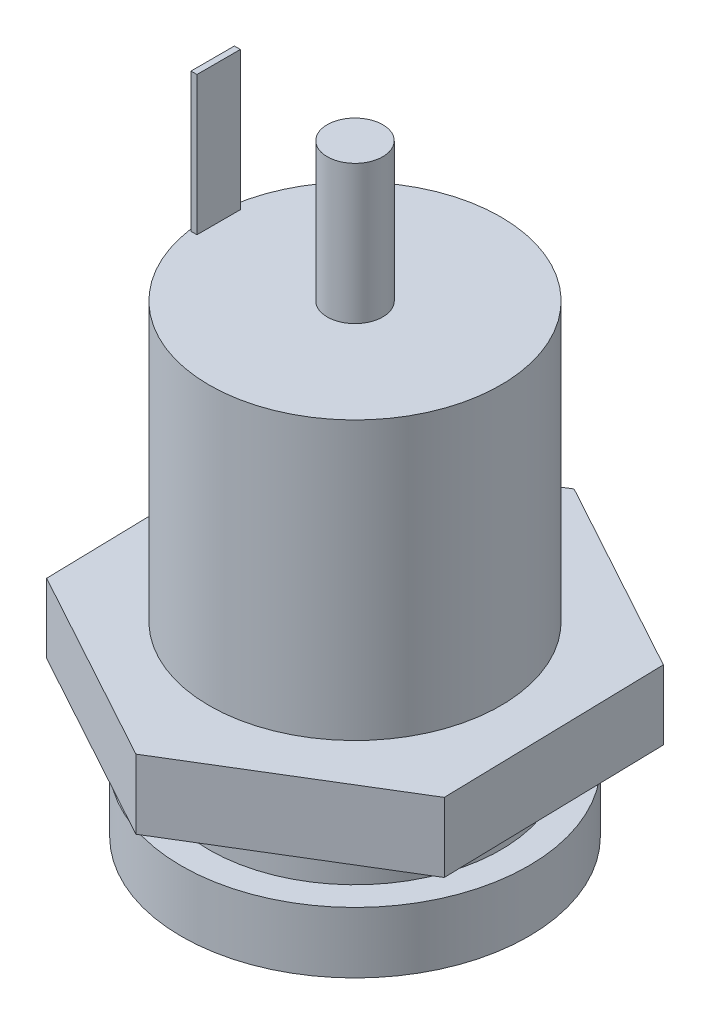
ISO-10303-21;
HEADER;
FILE_DESCRIPTION(('STEP AP214'),'2;1');
FILE_NAME('part.step','',(''),(''),'','','');
FILE_SCHEMA(('AUTOMOTIVE_DESIGN { 1 0 10303 214 1 1 1 1 }'));
ENDSEC;
DATA;
#1=APPLICATION_CONTEXT('core data for automotive mechanical design processes');
#2=APPLICATION_PROTOCOL_DEFINITION('international standard','automotive_design',2000,#1);
#3=PRODUCT_CONTEXT('',#1,'mechanical');
#4=PRODUCT('Part','Part','',(#3));
#5=PRODUCT_RELATED_PRODUCT_CATEGORY('part','',(#4));
#6=PRODUCT_DEFINITION_FORMATION('','',#4);
#7=PRODUCT_DEFINITION_CONTEXT('part definition',#1,'design');
#8=PRODUCT_DEFINITION('design','',#6,#7);
#9=PRODUCT_DEFINITION_SHAPE('','',#8);
#10=(LENGTH_UNIT() NAMED_UNIT(*) SI_UNIT(.MILLI.,.METRE.));
#11=(NAMED_UNIT(*) PLANE_ANGLE_UNIT() SI_UNIT($,.RADIAN.));
#12=(NAMED_UNIT(*) SI_UNIT($,.STERADIAN.) SOLID_ANGLE_UNIT());
#13=UNCERTAINTY_MEASURE_WITH_UNIT(LENGTH_MEASURE(1.E-05),#10,'distance_accuracy_value','');
#14=(GEOMETRIC_REPRESENTATION_CONTEXT(3) GLOBAL_UNCERTAINTY_ASSIGNED_CONTEXT((#13)) GLOBAL_UNIT_ASSIGNED_CONTEXT((#10,
#11,#12)) REPRESENTATION_CONTEXT('',''));
#15=CARTESIAN_POINT('',(0.,0.,0.));
#16=DIRECTION('',(0.,0.,1.));
#17=DIRECTION('',(1.,0.,0.));
#18=AXIS2_PLACEMENT_3D('',#15,#16,#17);
#19=CARTESIAN_POINT('',(0.,14.5,0.));
#20=DIRECTION('',(0.,1.,0.));
#21=DIRECTION('',(0.,0.,1.));
#22=AXIS2_PLACEMENT_3D('',#19,#20,#21);
#23=PLANE('',#22);
#24=CARTESIAN_POINT('',(0.,14.5,0.));
#25=DIRECTION('',(0.,1.,0.));
#26=DIRECTION('',(0.,0.,1.));
#27=AXIS2_PLACEMENT_3D('',#24,#25,#26);
#28=CIRCLE('',#27,1.);
#29=CARTESIAN_POINT('',(0.,14.5,1.));
#30=VERTEX_POINT('',#29);
#31=EDGE_CURVE('E55',#30,#30,#28,.T.);
#32=ORIENTED_EDGE('',*,*,#31,.F.);
#33=EDGE_LOOP('',(#32));
#34=FACE_BOUND('',#33,.T.);
#35=CARTESIAN_POINT('',(0.,14.5,0.));
#36=DIRECTION('',(0.,1.,0.));
#37=DIRECTION('',(0.,0.,1.));
#38=AXIS2_PLACEMENT_3D('',#35,#36,#37);
#39=CIRCLE('',#38,5.25);
#40=CARTESIAN_POINT('',(0.,14.5,-5.25));
#41=VERTEX_POINT('',#40);
#42=EDGE_CURVE('E181',#41,#41,#39,.T.);
#43=ORIENTED_EDGE('',*,*,#42,.T.);
#44=EDGE_LOOP('',(#43));
#45=FACE_BOUND('',#44,.T.);
#46=DIRECTION('',(1.,0.,0.));
#47=VECTOR('',#46,1.);
#48=CARTESIAN_POINT('',(-4.91146165372565,14.5,0.781146982699853));
#49=LINE('',#48,#47);
#50=CARTESIAN_POINT('',(-5.12627707396812,14.5,0.781146982699853));
#51=VERTEX_POINT('',#50);
#52=CARTESIAN_POINT('',(-4.91146165372565,14.5,0.781146982699853));
#53=VERTEX_POINT('',#52);
#54=EDGE_CURVE('E204',#51,#53,#49,.T.);
#55=ORIENTED_EDGE('',*,*,#54,.F.);
#56=DIRECTION('',(0.,0.,1.));
#57=VECTOR('',#56,1.);
#58=CARTESIAN_POINT('',(-5.12627707396812,14.5,-0.781146982699853));
#59=LINE('',#58,#57);
#60=CARTESIAN_POINT('',(-5.12627707396812,14.5,-0.781146982699853));
#61=VERTEX_POINT('',#60);
#62=EDGE_CURVE('E182',#61,#51,#59,.T.);
#63=ORIENTED_EDGE('',*,*,#62,.F.);
#64=DIRECTION('',(-1.,0.,0.));
#65=VECTOR('',#64,1.);
#66=CARTESIAN_POINT('',(-4.91146165372565,14.5,-0.781146982699853));
#67=LINE('',#66,#65);
#68=CARTESIAN_POINT('',(-4.91146165372565,14.5,-0.781146982699853));
#69=VERTEX_POINT('',#68);
#70=EDGE_CURVE('E92',#69,#61,#67,.T.);
#71=ORIENTED_EDGE('',*,*,#70,.F.);
#72=DIRECTION('',(0.,0.,-1.));
#73=VECTOR('',#72,1.);
#74=CARTESIAN_POINT('',(-4.91146165372565,14.5,-0.781146982699853));
#75=LINE('',#74,#73);
#76=EDGE_CURVE('E200',#53,#69,#75,.T.);
#77=ORIENTED_EDGE('',*,*,#76,.F.);
#78=EDGE_LOOP('',(#55,#63,#71,#77));
#79=FACE_BOUND('',#78,.T.);
#80=ADVANCED_FACE('F45',(#34,#45,#79),#23,.T.);
#81=CARTESIAN_POINT('',(0.,14.5,0.));
#82=DIRECTION('',(0.,-1.,0.));
#83=DIRECTION('',(0.,0.,-1.));
#84=AXIS2_PLACEMENT_3D('',#81,#82,#83);
#85=CYLINDRICAL_SURFACE('',#84,5.25);
#86=CARTESIAN_POINT('',(0.,4.5,0.));
#87=DIRECTION('',(0.,1.,0.));
#88=DIRECTION('',(0.,0.,1.));
#89=AXIS2_PLACEMENT_3D('',#86,#87,#88);
#90=CIRCLE('',#89,5.25);
#91=CARTESIAN_POINT('',(0.,4.5,-5.25));
#92=VERTEX_POINT('',#91);
#93=EDGE_CURVE('E49',#92,#92,#90,.T.);
#94=CARTESIAN_POINT('',(0.,4.5,-5.25));
#95=CARTESIAN_POINT('',(0.,4.60416666666667,-5.25));
#96=CARTESIAN_POINT('',(0.,4.70833333333333,-5.25));
#97=CARTESIAN_POINT('',(0.,4.91666666666667,-5.25));
#98=CARTESIAN_POINT('',(0.,5.02083333333333,-5.25));
#99=CARTESIAN_POINT('',(0.,5.22916666666667,-5.25));
#100=CARTESIAN_POINT('',(0.,5.33333333333333,-5.25));
#101=CARTESIAN_POINT('',(0.,5.54166666666667,-5.25));
#102=CARTESIAN_POINT('',(0.,5.64583333333333,-5.25));
#103=CARTESIAN_POINT('',(0.,5.85416666666667,-5.25));
#104=CARTESIAN_POINT('',(0.,5.95833333333333,-5.25));
#105=CARTESIAN_POINT('',(0.,6.16666666666667,-5.25));
#106=CARTESIAN_POINT('',(0.,6.27083333333333,-5.25));
#107=CARTESIAN_POINT('',(0.,6.47916666666667,-5.25));
#108=CARTESIAN_POINT('',(0.,6.58333333333333,-5.25));
#109=CARTESIAN_POINT('',(0.,6.79166666666667,-5.25));
#110=CARTESIAN_POINT('',(0.,6.89583333333333,-5.25));
#111=CARTESIAN_POINT('',(0.,7.10416666666667,-5.25));
#112=CARTESIAN_POINT('',(0.,7.20833333333333,-5.25));
#113=CARTESIAN_POINT('',(0.,7.41666666666667,-5.25));
#114=CARTESIAN_POINT('',(0.,7.52083333333333,-5.25));
#115=CARTESIAN_POINT('',(0.,7.72916666666667,-5.25));
#116=CARTESIAN_POINT('',(0.,7.83333333333333,-5.25));
#117=CARTESIAN_POINT('',(0.,8.04166666666667,-5.25));
#118=CARTESIAN_POINT('',(0.,8.14583333333333,-5.25));
#119=CARTESIAN_POINT('',(0.,8.35416666666667,-5.25));
#120=CARTESIAN_POINT('',(0.,8.45833333333333,-5.25));
#121=CARTESIAN_POINT('',(0.,8.66666666666667,-5.25));
#122=CARTESIAN_POINT('',(0.,8.77083333333333,-5.25));
#123=CARTESIAN_POINT('',(0.,8.97916666666667,-5.25));
#124=CARTESIAN_POINT('',(0.,9.08333333333333,-5.25));
#125=CARTESIAN_POINT('',(0.,9.29166666666667,-5.25));
#126=CARTESIAN_POINT('',(0.,9.39583333333333,-5.25));
#127=CARTESIAN_POINT('',(0.,9.60416666666667,-5.25));
#128=CARTESIAN_POINT('',(0.,9.70833333333333,-5.25));
#129=CARTESIAN_POINT('',(0.,9.91666666666667,-5.25));
#130=CARTESIAN_POINT('',(0.,10.0208333333333,-5.25));
#131=CARTESIAN_POINT('',(0.,10.2291666666667,-5.25));
#132=CARTESIAN_POINT('',(0.,10.3333333333333,-5.25));
#133=CARTESIAN_POINT('',(0.,10.5416666666667,-5.25));
#134=CARTESIAN_POINT('',(0.,10.6458333333333,-5.25));
#135=CARTESIAN_POINT('',(0.,10.8541666666667,-5.25));
#136=CARTESIAN_POINT('',(0.,10.9583333333333,-5.25));
#137=CARTESIAN_POINT('',(0.,11.1666666666667,-5.25));
#138=CARTESIAN_POINT('',(0.,11.2708333333333,-5.25));
#139=CARTESIAN_POINT('',(0.,11.4791666666667,-5.25));
#140=CARTESIAN_POINT('',(0.,11.5833333333333,-5.25));
#141=CARTESIAN_POINT('',(0.,11.7916666666667,-5.25));
#142=CARTESIAN_POINT('',(0.,11.8958333333333,-5.25));
#143=CARTESIAN_POINT('',(0.,12.1041666666667,-5.25));
#144=CARTESIAN_POINT('',(0.,12.2083333333333,-5.25));
#145=CARTESIAN_POINT('',(0.,12.4166666666667,-5.25));
#146=CARTESIAN_POINT('',(0.,12.5208333333333,-5.25));
#147=CARTESIAN_POINT('',(0.,12.7291666666667,-5.25));
#148=CARTESIAN_POINT('',(0.,12.8333333333333,-5.25));
#149=CARTESIAN_POINT('',(0.,13.0416666666667,-5.25));
#150=CARTESIAN_POINT('',(0.,13.1458333333333,-5.25));
#151=CARTESIAN_POINT('',(0.,13.3541666666667,-5.25));
#152=CARTESIAN_POINT('',(0.,13.4583333333333,-5.25));
#153=CARTESIAN_POINT('',(0.,13.6666666666667,-5.25));
#154=CARTESIAN_POINT('',(0.,13.7708333333333,-5.25));
#155=CARTESIAN_POINT('',(0.,13.9791666666667,-5.25));
#156=CARTESIAN_POINT('',(0.,14.0833333333333,-5.25));
#157=CARTESIAN_POINT('',(0.,14.2916666666667,-5.25));
#158=CARTESIAN_POINT('',(0.,14.3958333333333,-5.25));
#159=CARTESIAN_POINT('',(0.,14.5,-5.25));
#160=B_SPLINE_CURVE_WITH_KNOTS('',3,(#94,#95,#96,#97,#98,#99,#100,#101,#102,#103,#104,#105,#106,
#107,#108,#109,#110,#111,#112,#113,#114,#115,#116,#117,#118,#119,#120,#121,#122,#123,#124,#125,
#126,#127,#128,#129,#130,#131,#132,#133,#134,#135,#136,#137,#138,#139,#140,#141,#142,#143,#144,
#145,#146,#147,#148,#149,#150,#151,#152,#153,#154,#155,#156,#157,#158,#159),.UNSPECIFIED.,.F.,
.F.,(4,2,2,2,2,2,2,2,2,2,2,2,2,2,2,2,2,2,2,2,2,2,2,2,2,2,2,2,2,2,2,2,4),(0.,0.3125,
0.625000000000001,0.937500000000001,1.25,1.5625,1.875,2.1875,2.5,2.8125,3.125,3.4375,3.75,
4.0625,4.375,4.6875,5.,5.3125,5.625,5.9375,6.25,6.5625,6.875,7.1875,7.5,7.8125,8.125,8.4375,
8.75,9.0625,9.375,9.6875,10.),.UNSPECIFIED.);
#161=EDGE_CURVE('BSEAM47',#92,#41,#160,.T.);
#162=ORIENTED_EDGE('',*,*,#93,.T.);
#163=ORIENTED_EDGE('',*,*,#42,.F.);
#164=ORIENTED_EDGE('',*,*,#161,.T.);
#165=ORIENTED_EDGE('',*,*,#161,.F.);
#166=EDGE_LOOP('',(#162,#164,#163,#165));
#167=FACE_BOUND('',#166,.T.);
#168=ADVANCED_FACE('F47',(#167),#85,.T.);
#169=CARTESIAN_POINT('',(-5.12627707396812,19.5,-0.781146982699853));
#170=DIRECTION('',(1.,0.,0.));
#171=DIRECTION('',(0.,0.,-1.));
#172=AXIS2_PLACEMENT_3D('',#169,#170,#171);
#173=PLANE('',#172);
#174=ORIENTED_EDGE('',*,*,#62,.T.);
#175=DIRECTION('',(0.,-1.,0.));
#176=VECTOR('',#175,1.);
#177=CARTESIAN_POINT('',(-5.12627707396812,19.5,0.781146982699853));
#178=LINE('',#177,#176);
#179=CARTESIAN_POINT('',(-5.12627707396812,19.5,0.781146982699853));
#180=VERTEX_POINT('',#179);
#181=EDGE_CURVE('E71',#180,#51,#178,.T.);
#182=ORIENTED_EDGE('',*,*,#181,.F.);
#183=DIRECTION('',(0.,0.,1.));
#184=VECTOR('',#183,1.);
#185=CARTESIAN_POINT('',(-5.12627707396812,19.5,-0.781146982699853));
#186=LINE('',#185,#184);
#187=CARTESIAN_POINT('',(-5.12627707396812,19.5,-0.781146982699853));
#188=VERTEX_POINT('',#187);
#189=EDGE_CURVE('E201',#188,#180,#186,.T.);
#190=ORIENTED_EDGE('',*,*,#189,.F.);
#191=DIRECTION('',(0.,-1.,0.));
#192=VECTOR('',#191,1.);
#193=CARTESIAN_POINT('',(-5.12627707396812,19.5,-0.781146982699853));
#194=LINE('',#193,#192);
#195=EDGE_CURVE('E194',#188,#61,#194,.T.);
#196=ORIENTED_EDGE('',*,*,#195,.T.);
#197=EDGE_LOOP('',(#174,#182,#190,#196));
#198=FACE_BOUND('',#197,.T.);
#199=ADVANCED_FACE('F254',(#198),#173,.F.);
#200=CARTESIAN_POINT('',(-4.91146165372565,19.5,0.781146982699853));
#201=DIRECTION('',(0.,0.,-1.));
#202=DIRECTION('',(-1.,0.,0.));
#203=AXIS2_PLACEMENT_3D('',#200,#201,#202);
#204=PLANE('',#203);
#205=ORIENTED_EDGE('',*,*,#54,.T.);
#206=DIRECTION('',(0.,-1.,0.));
#207=VECTOR('',#206,1.);
#208=CARTESIAN_POINT('',(-4.91146165372565,19.5,0.781146982699853));
#209=LINE('',#208,#207);
#210=CARTESIAN_POINT('',(-4.91146165372565,19.5,0.781146982699853));
#211=VERTEX_POINT('',#210);
#212=EDGE_CURVE('E188',#211,#53,#209,.T.);
#213=ORIENTED_EDGE('',*,*,#212,.F.);
#214=DIRECTION('',(1.,0.,0.));
#215=VECTOR('',#214,1.);
#216=CARTESIAN_POINT('',(-4.91146165372565,19.5,0.781146982699853));
#217=LINE('',#216,#215);
#218=EDGE_CURVE('E88',#180,#211,#217,.T.);
#219=ORIENTED_EDGE('',*,*,#218,.F.);
#220=ORIENTED_EDGE('',*,*,#181,.T.);
#221=EDGE_LOOP('',(#205,#213,#219,#220));
#222=FACE_BOUND('',#221,.T.);
#223=ADVANCED_FACE('F270',(#222),#204,.F.);
#224=CARTESIAN_POINT('',(-4.91146165372565,19.5,-0.781146982699853));
#225=DIRECTION('',(-1.,0.,0.));
#226=DIRECTION('',(0.,0.,1.));
#227=AXIS2_PLACEMENT_3D('',#224,#225,#226);
#228=PLANE('',#227);
#229=ORIENTED_EDGE('',*,*,#76,.T.);
#230=DIRECTION('',(0.,-1.,0.));
#231=VECTOR('',#230,1.);
#232=CARTESIAN_POINT('',(-4.91146165372565,19.5,-0.781146982699853));
#233=LINE('',#232,#231);
#234=CARTESIAN_POINT('',(-4.91146165372565,19.5,-0.781146982699853));
#235=VERTEX_POINT('',#234);
#236=EDGE_CURVE('E62',#235,#69,#233,.T.);
#237=ORIENTED_EDGE('',*,*,#236,.F.);
#238=DIRECTION('',(0.,0.,-1.));
#239=VECTOR('',#238,1.);
#240=CARTESIAN_POINT('',(-4.91146165372565,19.5,-0.781146982699853));
#241=LINE('',#240,#239);
#242=EDGE_CURVE('E211',#211,#235,#241,.T.);
#243=ORIENTED_EDGE('',*,*,#242,.F.);
#244=ORIENTED_EDGE('',*,*,#212,.T.);
#245=EDGE_LOOP('',(#229,#237,#243,#244));
#246=FACE_BOUND('',#245,.T.);
#247=ADVANCED_FACE('F267',(#246),#228,.F.);
#248=CARTESIAN_POINT('',(-4.91146165372565,19.5,-0.781146982699853));
#249=DIRECTION('',(0.,0.,1.));
#250=DIRECTION('',(1.,0.,0.));
#251=AXIS2_PLACEMENT_3D('',#248,#249,#250);
#252=PLANE('',#251);
#253=ORIENTED_EDGE('',*,*,#70,.T.);
#254=ORIENTED_EDGE('',*,*,#195,.F.);
#255=DIRECTION('',(-1.,0.,0.));
#256=VECTOR('',#255,1.);
#257=CARTESIAN_POINT('',(-4.91146165372565,19.5,-0.781146982699853));
#258=LINE('',#257,#256);
#259=EDGE_CURVE('E197',#235,#188,#258,.T.);
#260=ORIENTED_EDGE('',*,*,#259,.F.);
#261=ORIENTED_EDGE('',*,*,#236,.T.);
#262=EDGE_LOOP('',(#253,#254,#260,#261));
#263=FACE_BOUND('',#262,.T.);
#264=ADVANCED_FACE('F263',(#263),#252,.F.);
#265=CARTESIAN_POINT('',(0.,19.5,0.));
#266=DIRECTION('',(0.,-1.,0.));
#267=DIRECTION('',(0.,0.,-1.));
#268=AXIS2_PLACEMENT_3D('',#265,#266,#267);
#269=PLANE('',#268);
#270=ORIENTED_EDGE('',*,*,#189,.T.);
#271=ORIENTED_EDGE('',*,*,#218,.T.);
#272=ORIENTED_EDGE('',*,*,#242,.T.);
#273=ORIENTED_EDGE('',*,*,#259,.T.);
#274=EDGE_LOOP('',(#270,#271,#272,#273));
#275=FACE_BOUND('',#274,.T.);
#276=ADVANCED_FACE('F259',(#275),#269,.F.);
#277=CARTESIAN_POINT('',(0.,19.5,0.));
#278=DIRECTION('',(0.,-1.,0.));
#279=DIRECTION('',(0.,0.,-1.));
#280=AXIS2_PLACEMENT_3D('',#277,#278,#279);
#281=CYLINDRICAL_SURFACE('',#280,1.);
#282=CARTESIAN_POINT('',(0.,19.5,0.));
#283=DIRECTION('',(0.,1.,0.));
#284=DIRECTION('',(0.,0.,1.));
#285=AXIS2_PLACEMENT_3D('',#282,#283,#284);
#286=CIRCLE('',#285,1.);
#287=CARTESIAN_POINT('',(0.,19.5,1.));
#288=VERTEX_POINT('',#287);
#289=EDGE_CURVE('E177',#288,#288,#286,.T.);
#290=ORIENTED_EDGE('',*,*,#289,.F.);
#291=EDGE_LOOP('',(#290));
#292=FACE_BOUND('',#291,.T.);
#293=ORIENTED_EDGE('',*,*,#31,.T.);
#294=EDGE_LOOP('',(#293));
#295=FACE_BOUND('',#294,.T.);
#296=ADVANCED_FACE('F262',(#292,#295),#281,.T.);
#297=CARTESIAN_POINT('',(0.,19.5,0.));
#298=DIRECTION('',(0.,1.,0.));
#299=DIRECTION('',(0.,0.,1.));
#300=AXIS2_PLACEMENT_3D('',#297,#298,#299);
#301=PLANE('',#300);
#302=ORIENTED_EDGE('',*,*,#289,.T.);
#303=EDGE_LOOP('',(#302));
#304=FACE_BOUND('',#303,.T.);
#305=ADVANCED_FACE('F277',(#304),#301,.T.);
#306=CARTESIAN_POINT('',(0.188462877478713,4.5,8.08070634766205));
#307=DIRECTION('',(-0.520056520986827,0.,-0.854131848709014));
#308=DIRECTION('',(-0.854131848709014,0.,0.520056520986827));
#309=AXIS2_PLACEMENT_3D('',#306,#307,#308);
#310=PLANE('',#309);
#311=DIRECTION('',(0.854131848709014,0.,-0.520056520986827));
#312=VECTOR('',#311,1.);
#313=CARTESIAN_POINT('',(0.188462877478713,2.,8.08070634766205));
#314=LINE('',#313,#312);
#315=CARTESIAN_POINT('',(0.188462877478713,2.,8.08070634766205));
#316=VERTEX_POINT('',#315);
#317=CARTESIAN_POINT('',(7.09232841633686,2.,3.87713953426415));
#318=VERTEX_POINT('',#317);
#319=EDGE_CURVE('E158',#316,#318,#314,.T.);
#320=ORIENTED_EDGE('',*,*,#319,.T.);
#321=DIRECTION('',(0.,-1.,0.));
#322=VECTOR('',#321,1.);
#323=CARTESIAN_POINT('',(7.09232841633686,4.5,3.87713953426415));
#324=LINE('',#323,#322);
#325=CARTESIAN_POINT('',(7.09232841633686,4.5,3.87713953426415));
#326=VERTEX_POINT('',#325);
#327=EDGE_CURVE('E136',#326,#318,#324,.T.);
#328=ORIENTED_EDGE('',*,*,#327,.F.);
#329=DIRECTION('',(0.854131848709014,0.,-0.520056520986827));
#330=VECTOR('',#329,1.);
#331=CARTESIAN_POINT('',(0.188462877478713,4.5,8.08070634766205));
#332=LINE('',#331,#330);
#333=CARTESIAN_POINT('',(0.188462877478713,4.5,8.08070634766205));
#334=VERTEX_POINT('',#333);
#335=EDGE_CURVE('E144',#334,#326,#332,.T.);
#336=ORIENTED_EDGE('',*,*,#335,.F.);
#337=DIRECTION('',(0.,-1.,0.));
#338=VECTOR('',#337,1.);
#339=CARTESIAN_POINT('',(0.188462877478713,4.5,8.08070634766205));
#340=LINE('',#339,#338);
#341=EDGE_CURVE('E344',#334,#316,#340,.T.);
#342=ORIENTED_EDGE('',*,*,#341,.T.);
#343=EDGE_LOOP('',(#320,#328,#336,#342));
#344=FACE_BOUND('',#343,.T.);
#345=ADVANCED_FACE('F156',(#344),#310,.F.);
#346=CARTESIAN_POINT('',(7.09232841633686,4.5,3.87713953426415));
#347=DIRECTION('',(-0.999728139656786,0.,0.0233162342238401));
#348=DIRECTION('',(0.0233162342238401,0.,0.999728139656786));
#349=AXIS2_PLACEMENT_3D('',#346,#347,#348);
#350=PLANE('',#349);
#351=DIRECTION('',(-0.0233162342238401,0.,-0.999728139656787));
#352=VECTOR('',#351,1.);
#353=CARTESIAN_POINT('',(7.09232841633686,2.,3.87713953426415));
#354=LINE('',#353,#352);
#355=CARTESIAN_POINT('',(6.90386553885815,2.,-4.20356681339791));
#356=VERTEX_POINT('',#355);
#357=EDGE_CURVE('E330',#318,#356,#354,.T.);
#358=ORIENTED_EDGE('',*,*,#357,.T.);
#359=DIRECTION('',(0.,-1.,0.));
#360=VECTOR('',#359,1.);
#361=CARTESIAN_POINT('',(6.90386553885815,4.5,-4.20356681339791));
#362=LINE('',#361,#360);
#363=CARTESIAN_POINT('',(6.90386553885815,4.5,-4.20356681339791));
#364=VERTEX_POINT('',#363);
#365=EDGE_CURVE('E139',#364,#356,#362,.T.);
#366=ORIENTED_EDGE('',*,*,#365,.F.);
#367=DIRECTION('',(-0.0233162342238401,0.,-0.999728139656787));
#368=VECTOR('',#367,1.);
#369=CARTESIAN_POINT('',(7.09232841633686,4.5,3.87713953426415));
#370=LINE('',#369,#368);
#371=EDGE_CURVE('E132',#326,#364,#370,.T.);
#372=ORIENTED_EDGE('',*,*,#371,.F.);
#373=ORIENTED_EDGE('',*,*,#327,.T.);
#374=EDGE_LOOP('',(#358,#366,#372,#373));
#375=FACE_BOUND('',#374,.T.);
#376=ADVANCED_FACE('F134',(#375),#350,.F.);
#377=CARTESIAN_POINT('',(6.90386553885815,4.5,-4.20356681339791));
#378=DIRECTION('',(-0.47967161866996,0.,0.877448082932854));
#379=DIRECTION('',(0.877448082932854,0.,0.47967161866996));
#380=AXIS2_PLACEMENT_3D('',#377,#378,#379);
#381=PLANE('',#380);
#382=DIRECTION('',(-0.877448082932854,0.,-0.47967161866996));
#383=VECTOR('',#382,1.);
#384=CARTESIAN_POINT('',(6.90386553885815,2.,-4.20356681339791));
#385=LINE('',#384,#383);
#386=CARTESIAN_POINT('',(-0.188462877478712,2.,-8.08070634766205));
#387=VERTEX_POINT('',#386);
#388=EDGE_CURVE('E348',#356,#387,#385,.T.);
#389=ORIENTED_EDGE('',*,*,#388,.T.);
#390=DIRECTION('',(0.,-1.,0.));
#391=VECTOR('',#390,1.);
#392=CARTESIAN_POINT('',(-0.188462877478712,4.5,-8.08070634766205));
#393=LINE('',#392,#391);
#394=CARTESIAN_POINT('',(-0.188462877478712,4.5,-8.08070634766205));
#395=VERTEX_POINT('',#394);
#396=EDGE_CURVE('E165',#395,#387,#393,.T.);
#397=ORIENTED_EDGE('',*,*,#396,.F.);
#398=DIRECTION('',(-0.877448082932854,0.,-0.47967161866996));
#399=VECTOR('',#398,1.);
#400=CARTESIAN_POINT('',(6.90386553885815,4.5,-4.20356681339791));
#401=LINE('',#400,#399);
#402=EDGE_CURVE('E143',#364,#395,#401,.T.);
#403=ORIENTED_EDGE('',*,*,#402,.F.);
#404=ORIENTED_EDGE('',*,*,#365,.T.);
#405=EDGE_LOOP('',(#389,#397,#403,#404));
#406=FACE_BOUND('',#405,.T.);
#407=ADVANCED_FACE('F289',(#406),#381,.F.);
#408=CARTESIAN_POINT('',(-0.188462877478712,4.5,-8.08070634766205));
#409=DIRECTION('',(0.520056520986827,0.,0.854131848709014));
#410=DIRECTION('',(0.854131848709014,0.,-0.520056520986827));
#411=AXIS2_PLACEMENT_3D('',#408,#409,#410);
#412=PLANE('',#411);
#413=DIRECTION('',(-0.854131848709014,0.,0.520056520986827));
#414=VECTOR('',#413,1.);
#415=CARTESIAN_POINT('',(-0.188462877478712,2.,-8.08070634766205));
#416=LINE('',#415,#414);
#417=CARTESIAN_POINT('',(-7.09232841633686,2.,-3.87713953426415));
#418=VERTEX_POINT('',#417);
#419=EDGE_CURVE('E351',#387,#418,#416,.T.);
#420=ORIENTED_EDGE('',*,*,#419,.T.);
#421=DIRECTION('',(0.,-1.,0.));
#422=VECTOR('',#421,1.);
#423=CARTESIAN_POINT('',(-7.09232841633686,4.5,-3.87713953426415));
#424=LINE('',#423,#422);
#425=CARTESIAN_POINT('',(-7.09232841633686,4.5,-3.87713953426415));
#426=VERTEX_POINT('',#425);
#427=EDGE_CURVE('E365',#426,#418,#424,.T.);
#428=ORIENTED_EDGE('',*,*,#427,.F.);
#429=DIRECTION('',(-0.854131848709014,0.,0.520056520986827));
#430=VECTOR('',#429,1.);
#431=CARTESIAN_POINT('',(-0.188462877478712,4.5,-8.08070634766205));
#432=LINE('',#431,#430);
#433=EDGE_CURVE('E337',#395,#426,#432,.T.);
#434=ORIENTED_EDGE('',*,*,#433,.F.);
#435=ORIENTED_EDGE('',*,*,#396,.T.);
#436=EDGE_LOOP('',(#420,#428,#434,#435));
#437=FACE_BOUND('',#436,.T.);
#438=ADVANCED_FACE('F294',(#437),#412,.F.);
#439=CARTESIAN_POINT('',(-7.09232841633686,4.5,-3.87713953426415));
#440=DIRECTION('',(0.999728139656786,0.,-0.02331623422384));
#441=DIRECTION('',(-0.02331623422384,0.,-0.999728139656786));
#442=AXIS2_PLACEMENT_3D('',#439,#440,#441);
#443=PLANE('',#442);
#444=DIRECTION('',(0.02331623422384,0.,0.999728139656786));
#445=VECTOR('',#444,1.);
#446=CARTESIAN_POINT('',(-7.09232841633686,2.,-3.87713953426415));
#447=LINE('',#446,#445);
#448=CARTESIAN_POINT('',(-6.90386553885815,2.,4.2035668133979));
#449=VERTEX_POINT('',#448);
#450=EDGE_CURVE('E354',#418,#449,#447,.T.);
#451=ORIENTED_EDGE('',*,*,#450,.T.);
#452=DIRECTION('',(0.,-1.,0.));
#453=VECTOR('',#452,1.);
#454=CARTESIAN_POINT('',(-6.90386553885815,4.5,4.2035668133979));
#455=LINE('',#454,#453);
#456=CARTESIAN_POINT('',(-6.90386553885815,4.5,4.2035668133979));
#457=VERTEX_POINT('',#456);
#458=EDGE_CURVE('E361',#457,#449,#455,.T.);
#459=ORIENTED_EDGE('',*,*,#458,.F.);
#460=DIRECTION('',(0.02331623422384,0.,0.999728139656786));
#461=VECTOR('',#460,1.);
#462=CARTESIAN_POINT('',(-7.09232841633686,4.5,-3.87713953426415));
#463=LINE('',#462,#461);
#464=EDGE_CURVE('E340',#426,#457,#463,.T.);
#465=ORIENTED_EDGE('',*,*,#464,.F.);
#466=ORIENTED_EDGE('',*,*,#427,.T.);
#467=EDGE_LOOP('',(#451,#459,#465,#466));
#468=FACE_BOUND('',#467,.T.);
#469=ADVANCED_FACE('F298',(#468),#443,.F.);
#470=CARTESIAN_POINT('',(-6.90386553885815,4.5,4.2035668133979));
#471=DIRECTION('',(0.47967161866996,0.,-0.877448082932854));
#472=DIRECTION('',(-0.877448082932854,0.,-0.47967161866996));
#473=AXIS2_PLACEMENT_3D('',#470,#471,#472);
#474=PLANE('',#473);
#475=DIRECTION('',(0.877448082932854,0.,0.47967161866996));
#476=VECTOR('',#475,1.);
#477=CARTESIAN_POINT('',(-6.90386553885815,2.,4.2035668133979));
#478=LINE('',#477,#476);
#479=EDGE_CURVE('E154',#449,#316,#478,.T.);
#480=ORIENTED_EDGE('',*,*,#479,.T.);
#481=ORIENTED_EDGE('',*,*,#341,.F.);
#482=DIRECTION('',(0.877448082932854,0.,0.47967161866996));
#483=VECTOR('',#482,1.);
#484=CARTESIAN_POINT('',(-6.90386553885815,4.5,4.2035668133979));
#485=LINE('',#484,#483);
#486=EDGE_CURVE('E149',#457,#334,#485,.T.);
#487=ORIENTED_EDGE('',*,*,#486,.F.);
#488=ORIENTED_EDGE('',*,*,#458,.T.);
#489=EDGE_LOOP('',(#480,#481,#487,#488));
#490=FACE_BOUND('',#489,.T.);
#491=ADVANCED_FACE('F302',(#490),#474,.F.);
#492=CARTESIAN_POINT('',(0.,4.5,0.));
#493=DIRECTION('',(0.,1.,0.));
#494=DIRECTION('',(0.,0.,1.));
#495=AXIS2_PLACEMENT_3D('',#492,#493,#494);
#496=PLANE('',#495);
#497=ORIENTED_EDGE('',*,*,#93,.F.);
#498=EDGE_LOOP('',(#497));
#499=FACE_BOUND('',#498,.T.);
#500=ORIENTED_EDGE('',*,*,#335,.T.);
#501=ORIENTED_EDGE('',*,*,#371,.T.);
#502=ORIENTED_EDGE('',*,*,#402,.T.);
#503=ORIENTED_EDGE('',*,*,#433,.T.);
#504=ORIENTED_EDGE('',*,*,#464,.T.);
#505=ORIENTED_EDGE('',*,*,#486,.T.);
#506=EDGE_LOOP('',(#500,#501,#502,#503,#504,#505));
#507=FACE_BOUND('',#506,.T.);
#508=ADVANCED_FACE('F147',(#499,#507),#496,.T.);
#509=CARTESIAN_POINT('',(0.,2.,0.));
#510=DIRECTION('',(0.,1.,0.));
#511=DIRECTION('',(0.,0.,1.));
#512=AXIS2_PLACEMENT_3D('',#509,#510,#511);
#513=PLANE('',#512);
#514=CARTESIAN_POINT('',(0.,2.,0.));
#515=DIRECTION('',(0.,1.,0.));
#516=DIRECTION('',(0.,0.,1.));
#517=AXIS2_PLACEMENT_3D('',#514,#515,#516);
#518=CIRCLE('',#517,5.25);
#519=CARTESIAN_POINT('',(0.,2.,-5.25));
#520=VERTEX_POINT('',#519);
#521=EDGE_CURVE('E11',#520,#520,#518,.T.);
#522=ORIENTED_EDGE('',*,*,#521,.T.);
#523=EDGE_LOOP('',(#522));
#524=FACE_BOUND('',#523,.T.);
#525=ORIENTED_EDGE('',*,*,#319,.F.);
#526=ORIENTED_EDGE('',*,*,#479,.F.);
#527=ORIENTED_EDGE('',*,*,#450,.F.);
#528=ORIENTED_EDGE('',*,*,#419,.F.);
#529=ORIENTED_EDGE('',*,*,#388,.F.);
#530=ORIENTED_EDGE('',*,*,#357,.F.);
#531=EDGE_LOOP('',(#525,#526,#527,#528,#529,#530));
#532=FACE_BOUND('',#531,.T.);
#533=ADVANCED_FACE('F243',(#524,#532),#513,.F.);
#534=CARTESIAN_POINT('',(0.,-2.2,0.));
#535=DIRECTION('',(0.,-1.,0.));
#536=DIRECTION('',(0.,0.,-1.));
#537=AXIS2_PLACEMENT_3D('',#534,#535,#536);
#538=PLANE('',#537);
#539=CARTESIAN_POINT('',(0.,-2.2,0.));
#540=DIRECTION('',(0.,-1.,0.));
#541=DIRECTION('',(0.,0.,-1.));
#542=AXIS2_PLACEMENT_3D('',#539,#540,#541);
#543=CIRCLE('',#542,2.25);
#544=CARTESIAN_POINT('',(0.,-2.2,-2.25));
#545=VERTEX_POINT('',#544);
#546=EDGE_CURVE('E326',#545,#545,#543,.T.);
#547=ORIENTED_EDGE('',*,*,#546,.F.);
#548=EDGE_LOOP('',(#547));
#549=FACE_BOUND('',#548,.T.);
#550=CARTESIAN_POINT('',(0.,-2.2,0.));
#551=DIRECTION('',(0.,-1.,0.));
#552=DIRECTION('',(0.,0.,-1.));
#553=AXIS2_PLACEMENT_3D('',#550,#551,#552);
#554=CIRCLE('',#553,6.25);
#555=CARTESIAN_POINT('',(0.,-2.2,-6.25));
#556=VERTEX_POINT('',#555);
#557=EDGE_CURVE('E169',#556,#556,#554,.T.);
#558=ORIENTED_EDGE('',*,*,#557,.T.);
#559=EDGE_LOOP('',(#558));
#560=FACE_BOUND('',#559,.T.);
#561=ADVANCED_FACE('F236',(#549,#560),#538,.T.);
#562=CARTESIAN_POINT('',(0.,-2.2,0.));
#563=DIRECTION('',(0.,1.,0.));
#564=DIRECTION('',(0.,0.,1.));
#565=AXIS2_PLACEMENT_3D('',#562,#563,#564);
#566=CYLINDRICAL_SURFACE('',#565,6.25);
#567=ORIENTED_EDGE('',*,*,#557,.F.);
#568=EDGE_LOOP('',(#567));
#569=FACE_BOUND('',#568,.T.);
#570=CARTESIAN_POINT('',(0.,0.,0.));
#571=DIRECTION('',(0.,-1.,0.));
#572=DIRECTION('',(0.,0.,-1.));
#573=AXIS2_PLACEMENT_3D('',#570,#571,#572);
#574=CIRCLE('',#573,6.25);
#575=CARTESIAN_POINT('',(0.,0.,-6.25));
#576=VERTEX_POINT('',#575);
#577=EDGE_CURVE('E164',#576,#576,#574,.T.);
#578=ORIENTED_EDGE('',*,*,#577,.T.);
#579=EDGE_LOOP('',(#578));
#580=FACE_BOUND('',#579,.T.);
#581=ADVANCED_FACE('F231',(#569,#580),#566,.T.);
#582=CARTESIAN_POINT('',(0.,0.,0.));
#583=DIRECTION('',(0.,-1.,0.));
#584=DIRECTION('',(0.,0.,-1.));
#585=AXIS2_PLACEMENT_3D('',#582,#583,#584);
#586=PLANE('',#585);
#587=CARTESIAN_POINT('',(0.,0.,0.));
#588=DIRECTION('',(0.,1.,0.));
#589=DIRECTION('',(0.,0.,1.));
#590=AXIS2_PLACEMENT_3D('',#587,#588,#589);
#591=CIRCLE('',#590,5.25);
#592=CARTESIAN_POINT('',(0.,0.,-5.25));
#593=VERTEX_POINT('',#592);
#594=EDGE_CURVE('E173',#593,#593,#591,.T.);
#595=ORIENTED_EDGE('',*,*,#594,.F.);
#596=EDGE_LOOP('',(#595));
#597=FACE_BOUND('',#596,.T.);
#598=ORIENTED_EDGE('',*,*,#577,.F.);
#599=EDGE_LOOP('',(#598));
#600=FACE_BOUND('',#599,.T.);
#601=ADVANCED_FACE('F228',(#597,#600),#586,.F.);
#602=CARTESIAN_POINT('',(0.,0.,-5.25));
#603=CARTESIAN_POINT('',(0.,0.0208333333333333,-5.25));
#604=CARTESIAN_POINT('',(0.,0.0416666666666667,-5.25));
#605=CARTESIAN_POINT('',(0.,0.0833333333333334,-5.25));
#606=CARTESIAN_POINT('',(0.,0.104166666666667,-5.25));
#607=CARTESIAN_POINT('',(0.,0.145833333333333,-5.25));
#608=CARTESIAN_POINT('',(0.,0.166666666666667,-5.25));
#609=CARTESIAN_POINT('',(0.,0.208333333333334,-5.25));
#610=CARTESIAN_POINT('',(0.,0.229166666666667,-5.25));
#611=CARTESIAN_POINT('',(0.,0.270833333333334,-5.25));
#612=CARTESIAN_POINT('',(0.,0.291666666666667,-5.25));
#613=CARTESIAN_POINT('',(0.,0.333333333333334,-5.25));
#614=CARTESIAN_POINT('',(0.,0.354166666666667,-5.25));
#615=CARTESIAN_POINT('',(0.,0.395833333333334,-5.25));
#616=CARTESIAN_POINT('',(0.,0.416666666666667,-5.25));
#617=CARTESIAN_POINT('',(0.,0.458333333333334,-5.25));
#618=CARTESIAN_POINT('',(0.,0.479166666666667,-5.25));
#619=CARTESIAN_POINT('',(0.,0.520833333333333,-5.25));
#620=CARTESIAN_POINT('',(0.,0.541666666666666,-5.25));
#621=CARTESIAN_POINT('',(0.,0.583333333333332,-5.25));
#622=CARTESIAN_POINT('',(0.,0.604166666666666,-5.25));
#623=CARTESIAN_POINT('',(0.,0.645833333333332,-5.25));
#624=CARTESIAN_POINT('',(0.,0.666666666666666,-5.25));
#625=CARTESIAN_POINT('',(0.,0.708333333333332,-5.25));
#626=CARTESIAN_POINT('',(0.,0.729166666666666,-5.25));
#627=CARTESIAN_POINT('',(0.,0.770833333333332,-5.25));
#628=CARTESIAN_POINT('',(0.,0.791666666666666,-5.25));
#629=CARTESIAN_POINT('',(0.,0.833333333333332,-5.25));
#630=CARTESIAN_POINT('',(0.,0.854166666666666,-5.25));
#631=CARTESIAN_POINT('',(0.,0.895833333333332,-5.25));
#632=CARTESIAN_POINT('',(0.,0.916666666666666,-5.25));
#633=CARTESIAN_POINT('',(0.,0.958333333333332,-5.25));
#634=CARTESIAN_POINT('',(0.,0.979166666666666,-5.25));
#635=CARTESIAN_POINT('',(0.,1.02083333333333,-5.25));
#636=CARTESIAN_POINT('',(0.,1.04166666666667,-5.25));
#637=CARTESIAN_POINT('',(0.,1.08333333333333,-5.25));
#638=CARTESIAN_POINT('',(0.,1.10416666666667,-5.25));
#639=CARTESIAN_POINT('',(0.,1.14583333333333,-5.25));
#640=CARTESIAN_POINT('',(0.,1.16666666666667,-5.25));
#641=CARTESIAN_POINT('',(0.,1.20833333333333,-5.25));
#642=CARTESIAN_POINT('',(0.,1.22916666666667,-5.25));
#643=CARTESIAN_POINT('',(0.,1.27083333333333,-5.25));
#644=CARTESIAN_POINT('',(0.,1.29166666666667,-5.25));
#645=CARTESIAN_POINT('',(0.,1.33333333333333,-5.25));
#646=CARTESIAN_POINT('',(0.,1.35416666666667,-5.25));
#647=CARTESIAN_POINT('',(0.,1.39583333333333,-5.25));
#648=CARTESIAN_POINT('',(0.,1.41666666666666,-5.25));
#649=CARTESIAN_POINT('',(0.,1.45833333333333,-5.25));
#650=CARTESIAN_POINT('',(0.,1.47916666666666,-5.25));
#651=CARTESIAN_POINT('',(0.,1.52083333333333,-5.25));
#652=CARTESIAN_POINT('',(0.,1.54166666666666,-5.25));
#653=CARTESIAN_POINT('',(0.,1.58333333333333,-5.25));
#654=CARTESIAN_POINT('',(0.,1.60416666666666,-5.25));
#655=CARTESIAN_POINT('',(0.,1.64583333333333,-5.25));
#656=CARTESIAN_POINT('',(0.,1.66666666666666,-5.25));
#657=CARTESIAN_POINT('',(0.,1.70833333333333,-5.25));
#658=CARTESIAN_POINT('',(0.,1.72916666666666,-5.25));
#659=CARTESIAN_POINT('',(0.,1.77083333333333,-5.25));
#660=CARTESIAN_POINT('',(0.,1.79166666666666,-5.25));
#661=CARTESIAN_POINT('',(0.,1.83333333333333,-5.25));
#662=CARTESIAN_POINT('',(0.,1.85416666666666,-5.25));
#663=CARTESIAN_POINT('',(0.,1.89583333333333,-5.25));
#664=CARTESIAN_POINT('',(0.,1.91666666666666,-5.25));
#665=CARTESIAN_POINT('',(0.,1.95833333333333,-5.25));
#666=CARTESIAN_POINT('',(0.,1.97916666666667,-5.25));
#667=CARTESIAN_POINT('',(0.,2.,-5.25));
#668=B_SPLINE_CURVE_WITH_KNOTS('',3,(#602,#603,#604,#605,#606,#607,#608,#609,#610,#611,#612,
#613,#614,#615,#616,#617,#618,#619,#620,#621,#622,#623,#624,#625,#626,#627,#628,#629,#630,#631,
#632,#633,#634,#635,#636,#637,#638,#639,#640,#641,#642,#643,#644,#645,#646,#647,#648,#649,#650,
#651,#652,#653,#654,#655,#656,#657,#658,#659,#660,#661,#662,#663,#664,#665,#666,#667),
.UNSPECIFIED.,.F.,.F.,(4,2,2,2,2,2,2,2,2,2,2,2,2,2,2,2,2,2,2,2,2,2,2,2,2,2,2,2,2,2,2,2,4),(0.,
0.0625000000000001,0.125,0.1875,0.25,0.3125,0.375,0.4375,0.5,0.562499999999999,
0.624999999999999,0.687499999999999,0.749999999999999,0.812499999999999,0.874999999999999,
0.937499999999999,0.999999999999999,1.0625,1.125,1.1875,1.25,1.3125,1.375,1.4375,1.5,1.5625,
1.625,1.6875,1.75,1.8125,1.875,1.9375,2.),.UNSPECIFIED.);
#669=EDGE_CURVE('BSEAM225',#593,#520,#668,.T.);
#670=ORIENTED_EDGE('',*,*,#594,.T.);
#671=ORIENTED_EDGE('',*,*,#521,.F.);
#672=ORIENTED_EDGE('',*,*,#669,.T.);
#673=ORIENTED_EDGE('',*,*,#669,.F.);
#674=EDGE_LOOP('',(#670,#672,#671,#673));
#675=FACE_BOUND('',#674,.T.);
#676=ADVANCED_FACE('F225',(#675),#85,.T.);
#677=CARTESIAN_POINT('',(0.,8.8,0.));
#678=DIRECTION('',(0.,-1.,0.));
#679=DIRECTION('',(0.,0.,-1.));
#680=AXIS2_PLACEMENT_3D('',#677,#678,#679);
#681=CYLINDRICAL_SURFACE('',#680,2.25);
#682=CARTESIAN_POINT('',(0.,8.8,0.));
#683=DIRECTION('',(0.,-1.,0.));
#684=DIRECTION('',(0.,0.,-1.));
#685=AXIS2_PLACEMENT_3D('',#682,#683,#684);
#686=CIRCLE('',#685,2.25);
#687=CARTESIAN_POINT('',(0.,8.8,-2.25));
#688=VERTEX_POINT('',#687);
#689=EDGE_CURVE('E324',#688,#688,#686,.T.);
#690=ORIENTED_EDGE('',*,*,#689,.F.);
#691=EDGE_LOOP('',(#690));
#692=FACE_BOUND('',#691,.T.);
#693=ORIENTED_EDGE('',*,*,#546,.T.);
#694=EDGE_LOOP('',(#693));
#695=FACE_BOUND('',#694,.T.);
#696=ADVANCED_FACE('F313',(#692,#695),#681,.F.);
#697=CARTESIAN_POINT('',(0.,8.8,0.));
#698=DIRECTION('',(0.,-1.,0.));
#699=DIRECTION('',(0.,0.,-1.));
#700=AXIS2_PLACEMENT_3D('',#697,#698,#699);
#701=PLANE('',#700);
#702=ORIENTED_EDGE('',*,*,#689,.T.);
#703=EDGE_LOOP('',(#702));
#704=FACE_BOUND('',#703,.T.);
#705=ADVANCED_FACE('F316',(#704),#701,.T.);
#706=CLOSED_SHELL('',(#80,#168,#199,#223,#247,#264,#276,#296,#305,#345,#376,#407,#438,#469,#491,
#508,#533,#561,#581,#601,#676,#696,#705));
#707=MANIFOLD_SOLID_BREP('B2',#706);
#708=ADVANCED_BREP_SHAPE_REPRESENTATION('',(#18,#707),#14);
#709=SHAPE_DEFINITION_REPRESENTATION(#9,#708);
ENDSEC;
END-ISO-10303-21;
